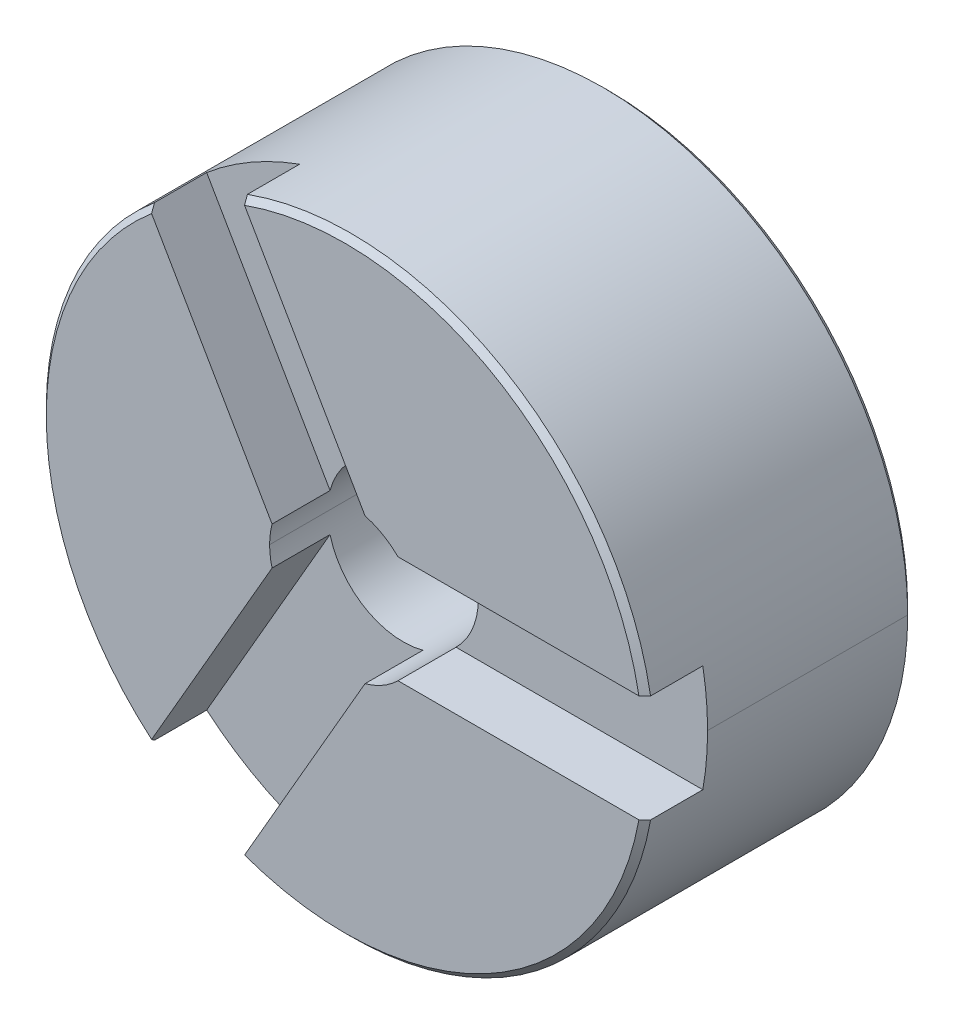
ISO-10303-21;
HEADER;
FILE_DESCRIPTION(('STEP AP214'),'2;1');
FILE_NAME('part.step','',(''),(''),'','','');
FILE_SCHEMA(('AUTOMOTIVE_DESIGN { 1 0 10303 214 1 1 1 1 }'));
ENDSEC;
DATA;
#1=APPLICATION_CONTEXT('core data for automotive mechanical design processes');
#2=APPLICATION_PROTOCOL_DEFINITION('international standard','automotive_design',2000,#1);
#3=PRODUCT_CONTEXT('',#1,'mechanical');
#4=PRODUCT('Part','Part','',(#3));
#5=PRODUCT_RELATED_PRODUCT_CATEGORY('part','',(#4));
#6=PRODUCT_DEFINITION_FORMATION('','',#4);
#7=PRODUCT_DEFINITION_CONTEXT('part definition',#1,'design');
#8=PRODUCT_DEFINITION('design','',#6,#7);
#9=PRODUCT_DEFINITION_SHAPE('','',#8);
#10=(LENGTH_UNIT() NAMED_UNIT(*) SI_UNIT(.MILLI.,.METRE.));
#11=(NAMED_UNIT(*) PLANE_ANGLE_UNIT() SI_UNIT($,.RADIAN.));
#12=(NAMED_UNIT(*) SI_UNIT($,.STERADIAN.) SOLID_ANGLE_UNIT());
#13=UNCERTAINTY_MEASURE_WITH_UNIT(LENGTH_MEASURE(1.E-05),#10,'distance_accuracy_value','');
#14=(GEOMETRIC_REPRESENTATION_CONTEXT(3) GLOBAL_UNCERTAINTY_ASSIGNED_CONTEXT((#13)) GLOBAL_UNIT_ASSIGNED_CONTEXT((#10,
#11,#12)) REPRESENTATION_CONTEXT('',''));
#15=CARTESIAN_POINT('',(0.,0.,0.));
#16=DIRECTION('',(0.,0.,1.));
#17=DIRECTION('',(1.,0.,0.));
#18=AXIS2_PLACEMENT_3D('',#15,#16,#17);
#19=CARTESIAN_POINT('',(0.,0.,0.));
#20=DIRECTION('',(0.,0.,-1.));
#21=DIRECTION('',(-1.,0.,0.));
#22=AXIS2_PLACEMENT_3D('',#19,#20,#21);
#23=CYLINDRICAL_SURFACE('',#22,105.);
#24=DIRECTION('',(0.,0.,1.));
#25=VECTOR('',#24,1.);
#26=CARTESIAN_POINT('',(105.,0.,-45.5));
#27=LINE('',#26,#25);
#28=CARTESIAN_POINT('',(105.,0.,-89.));
#29=VERTEX_POINT('',#28);
#30=CARTESIAN_POINT('',(105.,0.,-20.));
#31=VERTEX_POINT('',#30);
#32=EDGE_CURVE('E37',#29,#31,#27,.T.);
#33=ORIENTED_EDGE('',*,*,#32,.F.);
#34=CARTESIAN_POINT('',(0.,0.,-89.));
#35=DIRECTION('',(0.,0.,-1.));
#36=DIRECTION('',(-1.,0.,0.));
#37=AXIS2_PLACEMENT_3D('',#34,#35,#36);
#38=CIRCLE('',#37,105.);
#39=CARTESIAN_POINT('',(-105.,0.,-89.));
#40=VERTEX_POINT('',#39);
#41=EDGE_CURVE('E359',#40,#29,#38,.T.);
#42=ORIENTED_EDGE('',*,*,#41,.F.);
#43=DIRECTION('',(0.,0.,-1.));
#44=VECTOR('',#43,1.);
#45=CARTESIAN_POINT('',(-105.,0.,-45.5));
#46=LINE('',#45,#44);
#47=CARTESIAN_POINT('',(-105.,0.,-2.));
#48=VERTEX_POINT('',#47);
#49=EDGE_CURVE('E244',#48,#40,#46,.T.);
#50=ORIENTED_EDGE('',*,*,#49,.F.);
#51=CARTESIAN_POINT('',(0.,0.,-2.));
#52=DIRECTION('',(0.,0.,1.));
#53=DIRECTION('',(-1.,0.,0.));
#54=AXIS2_PLACEMENT_3D('',#51,#52,#53);
#55=CIRCLE('',#54,105.);
#56=CARTESIAN_POINT('',(-67.7001648064721,80.2601251255971,-2.));
#57=VERTEX_POINT('',#56);
#58=EDGE_CURVE('E436',#57,#48,#55,.T.);
#59=ORIENTED_EDGE('',*,*,#58,.F.);
#60=DIRECTION('',(0.,0.,1.));
#61=VECTOR('',#60,1.);
#62=CARTESIAN_POINT('',(-67.7001648064721,80.2601251255971,-11.));
#63=LINE('',#62,#61);
#64=CARTESIAN_POINT('',(-67.7001648064721,80.2601251255971,-20.));
#65=VERTEX_POINT('',#64);
#66=EDGE_CURVE('E278',#65,#57,#63,.T.);
#67=ORIENTED_EDGE('',*,*,#66,.F.);
#68=CARTESIAN_POINT('',(0.,0.,-20.));
#69=DIRECTION('',(0.,0.,1.));
#70=DIRECTION('',(1.,0.,0.));
#71=AXIS2_PLACEMENT_3D('',#68,#69,#70);
#72=CIRCLE('',#71,105.);
#73=CARTESIAN_POINT('',(-35.6572248664478,98.760125125597,-20.));
#74=VERTEX_POINT('',#73);
#75=EDGE_CURVE('E272',#74,#65,#72,.T.);
#76=ORIENTED_EDGE('',*,*,#75,.F.);
#77=DIRECTION('',(0.,0.,-1.));
#78=VECTOR('',#77,1.);
#79=CARTESIAN_POINT('',(-35.6572248664478,98.7601251255969,-11.));
#80=LINE('',#79,#78);
#81=CARTESIAN_POINT('',(-35.6572248664478,98.760125125597,-2.));
#82=VERTEX_POINT('',#81);
#83=EDGE_CURVE('E266',#82,#74,#80,.T.);
#84=ORIENTED_EDGE('',*,*,#83,.F.);
#85=CARTESIAN_POINT('',(0.,0.,-2.));
#86=DIRECTION('',(0.,0.,1.));
#87=DIRECTION('',(-1.,0.,0.));
#88=AXIS2_PLACEMENT_3D('',#85,#86,#87);
#89=CIRCLE('',#88,105.);
#90=CARTESIAN_POINT('',(103.357389672921,18.5,-2.));
#91=VERTEX_POINT('',#90);
#92=EDGE_CURVE('E298',#91,#82,#89,.T.);
#93=ORIENTED_EDGE('',*,*,#92,.F.);
#94=DIRECTION('',(0.,0.,-1.));
#95=VECTOR('',#94,1.);
#96=CARTESIAN_POINT('',(103.357389672921,18.5,-11.));
#97=LINE('',#96,#95);
#98=CARTESIAN_POINT('',(103.357389672921,18.5,-20.));
#99=VERTEX_POINT('',#98);
#100=EDGE_CURVE('E11',#91,#99,#97,.T.);
#101=ORIENTED_EDGE('',*,*,#100,.T.);
#102=CARTESIAN_POINT('',(0.,0.,-20.));
#103=DIRECTION('',(0.,0.,-1.));
#104=DIRECTION('',(1.,0.,0.));
#105=AXIS2_PLACEMENT_3D('',#102,#103,#104);
#106=CIRCLE('',#105,105.);
#107=EDGE_CURVE('E28',#99,#31,#106,.T.);
#108=ORIENTED_EDGE('',*,*,#107,.T.);
#109=EDGE_LOOP('',(#33,#42,#50,#59,#67,#76,#84,#93,#101,#108));
#110=FACE_BOUND('',#109,.T.);
#111=ADVANCED_FACE('F17',(#110),#23,.T.);
#112=CARTESIAN_POINT('',(0.,0.,0.));
#113=DIRECTION('',(0.,0.,-1.));
#114=DIRECTION('',(1.,0.,0.));
#115=AXIS2_PLACEMENT_3D('',#112,#113,#114);
#116=CONICAL_SURFACE('',#115,103.,0.785398163397448);
#117=DIRECTION('',(-0.707106781186547,0.,-0.707106781186548));
#118=VECTOR('',#117,1.);
#119=CARTESIAN_POINT('',(-103.,0.,0.));
#120=LINE('',#119,#118);
#121=CARTESIAN_POINT('',(-103.,0.,0.));
#122=VERTEX_POINT('',#121);
#123=EDGE_CURVE('E405',#122,#48,#120,.T.);
#124=ORIENTED_EDGE('',*,*,#123,.F.);
#125=CARTESIAN_POINT('',(0.,0.,0.));
#126=DIRECTION('',(0.,0.,-1.));
#127=DIRECTION('',(-1.,0.,0.));
#128=AXIS2_PLACEMENT_3D('',#125,#126,#127);
#129=CIRCLE('',#128,103.);
#130=CARTESIAN_POINT('',(-66.6839560914014,78.5,0.));
#131=VERTEX_POINT('',#130);
#132=EDGE_CURVE('E455',#122,#131,#129,.T.);
#133=ORIENTED_EDGE('',*,*,#132,.T.);
#134=CARTESIAN_POINT('',(3115.30832346852,-5432.87229535983,-6469.16924983146));
#135=DIRECTION('',(0.866025403743322,0.500000000071216,8.37208902852831E-11));
#136=DIRECTION('',(-0.350755756948617,0.607526791847581,0.712658120107242));
#137=AXIS2_PLACEMENT_3D('',#134,#135,#136);
#138=CIRCLE('',#137,9074.71488412742);
#139=EDGE_CURVE('E283',#57,#131,#138,.T.);
#140=ORIENTED_EDGE('',*,*,#139,.F.);
#141=ORIENTED_EDGE('',*,*,#58,.T.);
#142=EDGE_LOOP('',(#124,#133,#140,#141));
#143=FACE_BOUND('',#142,.T.);
#144=ADVANCED_FACE('F495',(#143),#116,.T.);
#145=CARTESIAN_POINT('',(0.,0.,0.));
#146=DIRECTION('',(0.,0.,1.));
#147=DIRECTION('',(-1.,0.,0.));
#148=AXIS2_PLACEMENT_3D('',#145,#146,#147);
#149=CYLINDRICAL_SURFACE('',#148,26.);
#150=DIRECTION('',(0.,0.,1.));
#151=VECTOR('',#150,1.);
#152=CARTESIAN_POINT('',(26.,0.,0.));
#153=LINE('',#152,#151);
#154=CARTESIAN_POINT('',(26.,0.,-86.));
#155=VERTEX_POINT('',#154);
#156=CARTESIAN_POINT('',(26.,0.,-20.));
#157=VERTEX_POINT('',#156);
#158=EDGE_CURVE('E349',#155,#157,#153,.T.);
#159=ORIENTED_EDGE('',*,*,#158,.F.);
#160=CARTESIAN_POINT('',(0.,0.,-86.));
#161=DIRECTION('',(0.,0.,-1.));
#162=DIRECTION('',(1.,0.,0.));
#163=AXIS2_PLACEMENT_3D('',#160,#161,#162);
#164=CIRCLE('',#163,26.);
#165=CARTESIAN_POINT('',(-26.,0.,-86.));
#166=VERTEX_POINT('',#165);
#167=EDGE_CURVE('E428',#155,#166,#164,.T.);
#168=ORIENTED_EDGE('',*,*,#167,.T.);
#169=DIRECTION('',(0.,0.,-1.));
#170=VECTOR('',#169,1.);
#171=CARTESIAN_POINT('',(-26.,0.,0.));
#172=LINE('',#171,#170);
#173=CARTESIAN_POINT('',(-26.,0.,0.));
#174=VERTEX_POINT('',#173);
#175=EDGE_CURVE('E400',#174,#166,#172,.T.);
#176=ORIENTED_EDGE('',*,*,#175,.F.);
#177=CARTESIAN_POINT('',(0.,0.,0.));
#178=DIRECTION('',(0.,0.,1.));
#179=DIRECTION('',(1.,0.,0.));
#180=AXIS2_PLACEMENT_3D('',#177,#178,#179);
#181=CIRCLE('',#180,26.);
#182=CARTESIAN_POINT('',(-25.1558829232347,-6.57126733229661,0.));
#183=VERTEX_POINT('',#182);
#184=EDGE_CURVE('E325',#174,#183,#181,.T.);
#185=ORIENTED_EDGE('',*,*,#184,.T.);
#186=DIRECTION('',(0.,0.,-1.));
#187=VECTOR('',#186,1.);
#188=CARTESIAN_POINT('',(-25.1558829232347,-6.57126733229661,-10.));
#189=LINE('',#188,#187);
#190=CARTESIAN_POINT('',(-25.1558829232347,-6.57126733229661,-20.));
#191=VERTEX_POINT('',#190);
#192=EDGE_CURVE('E234',#183,#191,#189,.T.);
#193=ORIENTED_EDGE('',*,*,#192,.T.);
#194=CARTESIAN_POINT('',(0.,0.,-20.));
#195=DIRECTION('',(0.,0.,1.));
#196=DIRECTION('',(-0.5,-0.866025403784436,0.));
#197=AXIS2_PLACEMENT_3D('',#194,#195,#196);
#198=CIRCLE('',#197,26.);
#199=CARTESIAN_POINT('',(6.88705701678943,-25.0712673322968,-20.));
#200=VERTEX_POINT('',#199);
#201=EDGE_CURVE('E229',#191,#200,#198,.T.);
#202=ORIENTED_EDGE('',*,*,#201,.T.);
#203=DIRECTION('',(0.,0.,1.));
#204=VECTOR('',#203,1.);
#205=CARTESIAN_POINT('',(6.88705701678943,-25.0712673322968,-10.));
#206=LINE('',#205,#204);
#207=CARTESIAN_POINT('',(6.88705701678943,-25.0712673322968,0.));
#208=VERTEX_POINT('',#207);
#209=EDGE_CURVE('E314',#200,#208,#206,.T.);
#210=ORIENTED_EDGE('',*,*,#209,.T.);
#211=CARTESIAN_POINT('',(0.,0.,0.));
#212=DIRECTION('',(0.,0.,1.));
#213=DIRECTION('',(-0.5,-0.866025403784436,0.));
#214=AXIS2_PLACEMENT_3D('',#211,#212,#213);
#215=CIRCLE('',#214,26.);
#216=CARTESIAN_POINT('',(18.2688259064451,-18.5,0.));
#217=VERTEX_POINT('',#216);
#218=EDGE_CURVE('E317',#208,#217,#215,.T.);
#219=ORIENTED_EDGE('',*,*,#218,.T.);
#220=DIRECTION('',(0.,0.,-1.));
#221=VECTOR('',#220,1.);
#222=CARTESIAN_POINT('',(18.2688259064451,-18.5,-10.));
#223=LINE('',#222,#221);
#224=CARTESIAN_POINT('',(18.2688259064451,-18.5,-20.));
#225=VERTEX_POINT('',#224);
#226=EDGE_CURVE('E188',#217,#225,#223,.T.);
#227=ORIENTED_EDGE('',*,*,#226,.T.);
#228=CARTESIAN_POINT('',(0.,0.,-20.));
#229=DIRECTION('',(0.,0.,1.));
#230=DIRECTION('',(1.,0.,0.));
#231=AXIS2_PLACEMENT_3D('',#228,#229,#230);
#232=CIRCLE('',#231,26.);
#233=EDGE_CURVE('E333',#225,#157,#232,.T.);
#234=ORIENTED_EDGE('',*,*,#233,.T.);
#235=EDGE_LOOP('',(#159,#168,#176,#185,#193,#202,#210,#219,#227,#234));
#236=FACE_BOUND('',#235,.T.);
#237=ADVANCED_FACE('F319',(#236),#149,.F.);
#238=CARTESIAN_POINT('',(0.,0.,-91.));
#239=DIRECTION('',(0.,0.,-1.));
#240=DIRECTION('',(1.,0.,0.));
#241=AXIS2_PLACEMENT_3D('',#238,#239,#240);
#242=CYLINDRICAL_SURFACE('',#241,85.);
#243=DIRECTION('',(0.,0.,-1.));
#244=VECTOR('',#243,1.);
#245=CARTESIAN_POINT('',(-85.,0.,-91.));
#246=LINE('',#245,#244);
#247=CARTESIAN_POINT('',(-85.,0.,-86.));
#248=VERTEX_POINT('',#247);
#249=CARTESIAN_POINT('',(-85.,0.,-91.));
#250=VERTEX_POINT('',#249);
#251=EDGE_CURVE('E338',#248,#250,#246,.T.);
#252=ORIENTED_EDGE('',*,*,#251,.F.);
#253=CARTESIAN_POINT('',(0.,0.,-86.));
#254=DIRECTION('',(0.,0.,-1.));
#255=DIRECTION('',(-1.,0.,0.));
#256=AXIS2_PLACEMENT_3D('',#253,#254,#255);
#257=CIRCLE('',#256,85.);
#258=CARTESIAN_POINT('',(85.,0.,-86.));
#259=VERTEX_POINT('',#258);
#260=EDGE_CURVE('E182',#259,#248,#257,.T.);
#261=ORIENTED_EDGE('',*,*,#260,.F.);
#262=DIRECTION('',(0.,0.,1.));
#263=VECTOR('',#262,1.);
#264=CARTESIAN_POINT('',(85.,0.,-91.));
#265=LINE('',#264,#263);
#266=CARTESIAN_POINT('',(85.,0.,-91.));
#267=VERTEX_POINT('',#266);
#268=EDGE_CURVE('E345',#267,#259,#265,.T.);
#269=ORIENTED_EDGE('',*,*,#268,.F.);
#270=CARTESIAN_POINT('',(0.,0.,-91.));
#271=DIRECTION('',(0.,0.,-1.));
#272=DIRECTION('',(-1.,0.,0.));
#273=AXIS2_PLACEMENT_3D('',#270,#271,#272);
#274=CIRCLE('',#273,85.);
#275=EDGE_CURVE('E337',#267,#250,#274,.T.);
#276=ORIENTED_EDGE('',*,*,#275,.T.);
#277=EDGE_LOOP('',(#252,#261,#269,#276));
#278=FACE_BOUND('',#277,.T.);
#279=ADVANCED_FACE('F484',(#278),#242,.F.);
#280=CARTESIAN_POINT('',(0.,0.,-91.));
#281=DIRECTION('',(0.,0.,1.));
#282=DIRECTION('',(1.,0.,0.));
#283=AXIS2_PLACEMENT_3D('',#280,#281,#282);
#284=CONICAL_SURFACE('',#283,103.,0.785398163397448);
#285=DIRECTION('',(-0.707106781186547,0.,0.707106781186548));
#286=VECTOR('',#285,1.);
#287=CARTESIAN_POINT('',(-103.,0.,-91.));
#288=LINE('',#287,#286);
#289=CARTESIAN_POINT('',(-103.,0.,-91.));
#290=VERTEX_POINT('',#289);
#291=EDGE_CURVE('E354',#290,#40,#288,.T.);
#292=ORIENTED_EDGE('',*,*,#291,.F.);
#293=CARTESIAN_POINT('',(0.,0.,-91.));
#294=DIRECTION('',(0.,0.,1.));
#295=DIRECTION('',(-1.,0.,0.));
#296=AXIS2_PLACEMENT_3D('',#293,#294,#295);
#297=CIRCLE('',#296,103.);
#298=CARTESIAN_POINT('',(103.,0.,-91.));
#299=VERTEX_POINT('',#298);
#300=EDGE_CURVE('E353',#290,#299,#297,.T.);
#301=ORIENTED_EDGE('',*,*,#300,.T.);
#302=DIRECTION('',(-0.707106781186547,0.,-0.707106781186548));
#303=VECTOR('',#302,1.);
#304=CARTESIAN_POINT('',(103.,0.,-91.));
#305=LINE('',#304,#303);
#306=EDGE_CURVE('E363',#29,#299,#305,.T.);
#307=ORIENTED_EDGE('',*,*,#306,.F.);
#308=CARTESIAN_POINT('',(0.,0.,-89.));
#309=DIRECTION('',(0.,0.,-1.));
#310=DIRECTION('',(-1.,0.,0.));
#311=AXIS2_PLACEMENT_3D('',#308,#309,#310);
#312=CIRCLE('',#311,105.);
#313=EDGE_CURVE('E358',#29,#40,#312,.T.);
#314=ORIENTED_EDGE('',*,*,#313,.T.);
#315=EDGE_LOOP('',(#292,#301,#307,#314));
#316=FACE_BOUND('',#315,.T.);
#317=ADVANCED_FACE('F472',(#316),#284,.T.);
#318=CARTESIAN_POINT('',(0.,0.,-91.));
#319=DIRECTION('',(0.,0.,1.));
#320=DIRECTION('',(1.,0.,0.));
#321=AXIS2_PLACEMENT_3D('',#318,#319,#320);
#322=CONICAL_SURFACE('',#321,103.,0.785398163397448);
#323=ORIENTED_EDGE('',*,*,#291,.T.);
#324=ORIENTED_EDGE('',*,*,#41,.T.);
#325=ORIENTED_EDGE('',*,*,#306,.T.);
#326=CARTESIAN_POINT('',(0.,0.,-91.));
#327=DIRECTION('',(0.,0.,1.));
#328=DIRECTION('',(-1.,0.,0.));
#329=AXIS2_PLACEMENT_3D('',#326,#327,#328);
#330=CIRCLE('',#329,103.);
#331=EDGE_CURVE('E341',#299,#290,#330,.T.);
#332=ORIENTED_EDGE('',*,*,#331,.T.);
#333=EDGE_LOOP('',(#323,#324,#325,#332));
#334=FACE_BOUND('',#333,.T.);
#335=ADVANCED_FACE('F468',(#334),#322,.T.);
#336=CARTESIAN_POINT('',(0.,0.,-91.));
#337=DIRECTION('',(0.,0.,-1.));
#338=DIRECTION('',(1.,0.,0.));
#339=AXIS2_PLACEMENT_3D('',#336,#337,#338);
#340=CYLINDRICAL_SURFACE('',#339,85.);
#341=ORIENTED_EDGE('',*,*,#251,.T.);
#342=CARTESIAN_POINT('',(0.,0.,-91.));
#343=DIRECTION('',(0.,0.,-1.));
#344=DIRECTION('',(-1.,0.,0.));
#345=AXIS2_PLACEMENT_3D('',#342,#343,#344);
#346=CIRCLE('',#345,85.);
#347=EDGE_CURVE('E342',#250,#267,#346,.T.);
#348=ORIENTED_EDGE('',*,*,#347,.T.);
#349=ORIENTED_EDGE('',*,*,#268,.T.);
#350=CARTESIAN_POINT('',(0.,0.,-86.));
#351=DIRECTION('',(0.,0.,-1.));
#352=DIRECTION('',(-1.,0.,0.));
#353=AXIS2_PLACEMENT_3D('',#350,#351,#352);
#354=CIRCLE('',#353,85.);
#355=EDGE_CURVE('E212',#248,#259,#354,.T.);
#356=ORIENTED_EDGE('',*,*,#355,.F.);
#357=EDGE_LOOP('',(#341,#348,#349,#356));
#358=FACE_BOUND('',#357,.T.);
#359=ADVANCED_FACE('F480',(#358),#340,.F.);
#360=CARTESIAN_POINT('',(0.,0.,0.));
#361=DIRECTION('',(0.,0.,1.));
#362=DIRECTION('',(-1.,0.,0.));
#363=AXIS2_PLACEMENT_3D('',#360,#361,#362);
#364=CYLINDRICAL_SURFACE('',#363,26.);
#365=ORIENTED_EDGE('',*,*,#158,.T.);
#366=CARTESIAN_POINT('',(0.,0.,-20.));
#367=DIRECTION('',(0.,0.,1.));
#368=DIRECTION('',(1.,0.,0.));
#369=AXIS2_PLACEMENT_3D('',#366,#367,#368);
#370=CIRCLE('',#369,26.);
#371=CARTESIAN_POINT('',(18.2688259064451,18.5,-20.));
#372=VERTEX_POINT('',#371);
#373=EDGE_CURVE('E378',#157,#372,#370,.T.);
#374=ORIENTED_EDGE('',*,*,#373,.T.);
#375=DIRECTION('',(0.,0.,1.));
#376=VECTOR('',#375,1.);
#377=CARTESIAN_POINT('',(18.2688259064451,18.5,-10.));
#378=LINE('',#377,#376);
#379=CARTESIAN_POINT('',(18.2688259064451,18.5,0.));
#380=VERTEX_POINT('',#379);
#381=EDGE_CURVE('E382',#372,#380,#378,.T.);
#382=ORIENTED_EDGE('',*,*,#381,.T.);
#383=CARTESIAN_POINT('',(0.,0.,0.));
#384=DIRECTION('',(0.,0.,1.));
#385=DIRECTION('',(1.,0.,0.));
#386=AXIS2_PLACEMENT_3D('',#383,#384,#385);
#387=CIRCLE('',#386,26.);
#388=CARTESIAN_POINT('',(6.88705701678968,25.0712673322967,0.));
#389=VERTEX_POINT('',#388);
#390=EDGE_CURVE('E386',#380,#389,#387,.T.);
#391=ORIENTED_EDGE('',*,*,#390,.T.);
#392=DIRECTION('',(0.,0.,1.));
#393=VECTOR('',#392,1.);
#394=CARTESIAN_POINT('',(6.88705701678967,25.0712673322967,-10.));
#395=LINE('',#394,#393);
#396=CARTESIAN_POINT('',(6.88705701678968,25.0712673322967,-20.));
#397=VERTEX_POINT('',#396);
#398=EDGE_CURVE('E261',#397,#389,#395,.T.);
#399=ORIENTED_EDGE('',*,*,#398,.F.);
#400=CARTESIAN_POINT('',(0.,0.,-20.));
#401=DIRECTION('',(0.,0.,-1.));
#402=DIRECTION('',(1.,0.,0.));
#403=AXIS2_PLACEMENT_3D('',#400,#401,#402);
#404=CIRCLE('',#403,26.);
#405=CARTESIAN_POINT('',(-25.1558829232346,6.57126733229686,-20.));
#406=VERTEX_POINT('',#405);
#407=EDGE_CURVE('E271',#406,#397,#404,.T.);
#408=ORIENTED_EDGE('',*,*,#407,.F.);
#409=DIRECTION('',(0.,0.,-1.));
#410=VECTOR('',#409,1.);
#411=CARTESIAN_POINT('',(-25.1558829232346,6.57126733229686,-10.));
#412=LINE('',#411,#410);
#413=CARTESIAN_POINT('',(-25.1558829232346,6.57126733229686,0.));
#414=VERTEX_POINT('',#413);
#415=EDGE_CURVE('E277',#414,#406,#412,.T.);
#416=ORIENTED_EDGE('',*,*,#415,.F.);
#417=CARTESIAN_POINT('',(0.,0.,0.));
#418=DIRECTION('',(0.,0.,1.));
#419=DIRECTION('',(1.,0.,0.));
#420=AXIS2_PLACEMENT_3D('',#417,#418,#419);
#421=CIRCLE('',#420,26.);
#422=EDGE_CURVE('E390',#414,#174,#421,.T.);
#423=ORIENTED_EDGE('',*,*,#422,.T.);
#424=ORIENTED_EDGE('',*,*,#175,.T.);
#425=CARTESIAN_POINT('',(0.,0.,-86.));
#426=DIRECTION('',(0.,0.,-1.));
#427=DIRECTION('',(1.,0.,0.));
#428=AXIS2_PLACEMENT_3D('',#425,#426,#427);
#429=CIRCLE('',#428,26.);
#430=EDGE_CURVE('E401',#166,#155,#429,.T.);
#431=ORIENTED_EDGE('',*,*,#430,.T.);
#432=EDGE_LOOP('',(#365,#374,#382,#391,#399,#408,#416,#423,#424,#431));
#433=FACE_BOUND('',#432,.T.);
#434=ADVANCED_FACE('F438',(#433),#364,.F.);
#435=CARTESIAN_POINT('',(0.,0.,0.));
#436=DIRECTION('',(0.,0.,-1.));
#437=DIRECTION('',(1.,0.,0.));
#438=AXIS2_PLACEMENT_3D('',#435,#436,#437);
#439=CONICAL_SURFACE('',#438,103.,0.785398163397448);
#440=ORIENTED_EDGE('',*,*,#123,.T.);
#441=CARTESIAN_POINT('',(0.,0.,-2.));
#442=DIRECTION('',(0.,0.,1.));
#443=DIRECTION('',(-1.,0.,0.));
#444=AXIS2_PLACEMENT_3D('',#441,#442,#443);
#445=CIRCLE('',#444,105.);
#446=CARTESIAN_POINT('',(-67.7001648064729,-80.2601251255965,-2.));
#447=VERTEX_POINT('',#446);
#448=EDGE_CURVE('E406',#48,#447,#445,.T.);
#449=ORIENTED_EDGE('',*,*,#448,.T.);
#450=CARTESIAN_POINT('',(3115.30832311077,5432.87229605646,-6469.16925026273));
#451=DIRECTION('',(-0.86602540376874,0.500000000027191,-3.19963366902484E-11));
#452=DIRECTION('',(-0.350755756885806,-0.607526791883838,0.712658120107248));
#453=AXIS2_PLACEMENT_3D('',#450,#451,#452);
#454=CIRCLE('',#453,9074.71488473251);
#455=CARTESIAN_POINT('',(-66.6839560914021,-78.5,0.));
#456=VERTEX_POINT('',#455);
#457=EDGE_CURVE('E239',#447,#456,#454,.T.);
#458=ORIENTED_EDGE('',*,*,#457,.T.);
#459=CARTESIAN_POINT('',(0.,0.,0.));
#460=DIRECTION('',(0.,0.,-1.));
#461=DIRECTION('',(-1.,0.,0.));
#462=AXIS2_PLACEMENT_3D('',#459,#460,#461);
#463=CIRCLE('',#462,103.);
#464=EDGE_CURVE('E411',#456,#122,#463,.T.);
#465=ORIENTED_EDGE('',*,*,#464,.T.);
#466=EDGE_LOOP('',(#440,#449,#458,#465));
#467=FACE_BOUND('',#466,.T.);
#468=ADVANCED_FACE('F458',(#467),#439,.T.);
#469=CARTESIAN_POINT('',(0.,0.,0.));
#470=DIRECTION('',(0.,0.,-1.));
#471=DIRECTION('',(-1.,0.,0.));
#472=AXIS2_PLACEMENT_3D('',#469,#470,#471);
#473=CYLINDRICAL_SURFACE('',#472,105.);
#474=ORIENTED_EDGE('',*,*,#32,.T.);
#475=CARTESIAN_POINT('',(0.,0.,-20.));
#476=DIRECTION('',(0.,0.,-1.));
#477=DIRECTION('',(1.,0.,0.));
#478=AXIS2_PLACEMENT_3D('',#475,#476,#477);
#479=CIRCLE('',#478,105.);
#480=CARTESIAN_POINT('',(103.357389672921,-18.5,-20.));
#481=VERTEX_POINT('',#480);
#482=EDGE_CURVE('E415',#31,#481,#479,.T.);
#483=ORIENTED_EDGE('',*,*,#482,.T.);
#484=DIRECTION('',(0.,0.,1.));
#485=VECTOR('',#484,1.);
#486=CARTESIAN_POINT('',(103.357389672921,-18.5,-11.));
#487=LINE('',#486,#485);
#488=CARTESIAN_POINT('',(103.357389672921,-18.5,-2.));
#489=VERTEX_POINT('',#488);
#490=EDGE_CURVE('E254',#481,#489,#487,.T.);
#491=ORIENTED_EDGE('',*,*,#490,.T.);
#492=CARTESIAN_POINT('',(0.,0.,-2.));
#493=DIRECTION('',(0.,0.,1.));
#494=DIRECTION('',(0.5,0.866025403784436,0.));
#495=AXIS2_PLACEMENT_3D('',#492,#493,#494);
#496=CIRCLE('',#495,105.);
#497=CARTESIAN_POINT('',(-35.6572248664488,-98.7601251255966,-2.));
#498=VERTEX_POINT('',#497);
#499=EDGE_CURVE('E178',#498,#489,#496,.T.);
#500=ORIENTED_EDGE('',*,*,#499,.F.);
#501=DIRECTION('',(0.,0.,-1.));
#502=VECTOR('',#501,1.);
#503=CARTESIAN_POINT('',(-35.6572248664488,-98.7601251255966,-11.));
#504=LINE('',#503,#502);
#505=CARTESIAN_POINT('',(-35.6572248664488,-98.7601251255966,-20.));
#506=VERTEX_POINT('',#505);
#507=EDGE_CURVE('E247',#498,#506,#504,.T.);
#508=ORIENTED_EDGE('',*,*,#507,.T.);
#509=CARTESIAN_POINT('',(0.,0.,-20.));
#510=DIRECTION('',(0.,0.,-1.));
#511=DIRECTION('',(-0.5,-0.866025403784436,0.));
#512=AXIS2_PLACEMENT_3D('',#509,#510,#511);
#513=CIRCLE('',#512,105.);
#514=CARTESIAN_POINT('',(-67.7001648064729,-80.2601251255965,-20.));
#515=VERTEX_POINT('',#514);
#516=EDGE_CURVE('E226',#506,#515,#513,.T.);
#517=ORIENTED_EDGE('',*,*,#516,.T.);
#518=DIRECTION('',(0.,0.,1.));
#519=VECTOR('',#518,1.);
#520=CARTESIAN_POINT('',(-67.7001648064729,-80.2601251255965,-11.));
#521=LINE('',#520,#519);
#522=EDGE_CURVE('E237',#515,#447,#521,.T.);
#523=ORIENTED_EDGE('',*,*,#522,.T.);
#524=ORIENTED_EDGE('',*,*,#448,.F.);
#525=ORIENTED_EDGE('',*,*,#49,.T.);
#526=ORIENTED_EDGE('',*,*,#313,.F.);
#527=EDGE_LOOP('',(#474,#483,#491,#500,#508,#517,#523,#524,#525,#526));
#528=FACE_BOUND('',#527,.T.);
#529=ADVANCED_FACE('F246',(#528),#473,.T.);
#530=CARTESIAN_POINT('',(16.0214699700122,9.25,-9.));
#531=DIRECTION('',(0.866025403784441,0.5,0.));
#532=DIRECTION('',(0.,0.,1.));
#533=AXIS2_PLACEMENT_3D('',#530,#531,#532);
#534=PLANE('',#533);
#535=ORIENTED_EDGE('',*,*,#398,.T.);
#536=DIRECTION('',(-0.5,0.866025403784441,0.));
#537=VECTOR('',#536,1.);
#538=CARTESIAN_POINT('',(16.0214699700121,9.25,0.));
#539=LINE('',#538,#537);
#540=CARTESIAN_POINT('',(-34.6410161513771,97.,0.));
#541=VERTEX_POINT('',#540);
#542=EDGE_CURVE('E257',#389,#541,#539,.T.);
#543=ORIENTED_EDGE('',*,*,#542,.T.);
#544=CARTESIAN_POINT('',(3147.58871754416,-5414.78358083445,-6469.65185826135));
#545=DIRECTION('',(-0.866025403798294,-0.499999999976001,2.81832198505629E-11));
#546=DIRECTION('',(-0.35064377855075,0.607332839886878,0.712878504486278));
#547=AXIS2_PLACEMENT_3D('',#544,#545,#546);
#548=CIRCLE('',#547,9075.39197429382);
#549=EDGE_CURVE('E262',#541,#82,#548,.T.);
#550=ORIENTED_EDGE('',*,*,#549,.T.);
#551=ORIENTED_EDGE('',*,*,#83,.T.);
#552=DIRECTION('',(-0.5,0.866025403784441,0.));
#553=VECTOR('',#552,1.);
#554=CARTESIAN_POINT('',(16.0214699700122,9.25,-20.));
#555=LINE('',#554,#553);
#556=EDGE_CURVE('E267',#397,#74,#555,.T.);
#557=ORIENTED_EDGE('',*,*,#556,.F.);
#558=EDGE_LOOP('',(#535,#543,#550,#551,#557));
#559=FACE_BOUND('',#558,.T.);
#560=ADVANCED_FACE('F520',(#559),#534,.F.);
#561=CARTESIAN_POINT('',(0.,0.,-20.));
#562=DIRECTION('',(0.,0.,-1.));
#563=DIRECTION('',(0.,1.,0.));
#564=AXIS2_PLACEMENT_3D('',#561,#562,#563);
#565=PLANE('',#564);
#566=ORIENTED_EDGE('',*,*,#407,.T.);
#567=ORIENTED_EDGE('',*,*,#556,.T.);
#568=ORIENTED_EDGE('',*,*,#75,.T.);
#569=DIRECTION('',(-0.5,0.866025403784441,0.));
#570=VECTOR('',#569,1.);
#571=CARTESIAN_POINT('',(-16.0214699700122,-9.25,-20.));
#572=LINE('',#571,#570);
#573=EDGE_CURVE('E273',#406,#65,#572,.T.);
#574=ORIENTED_EDGE('',*,*,#573,.F.);
#575=EDGE_LOOP('',(#566,#567,#568,#574));
#576=FACE_BOUND('',#575,.T.);
#577=ADVANCED_FACE('F523',(#576),#565,.F.);
#578=CARTESIAN_POINT('',(-16.0214699700122,-9.25,-9.));
#579=DIRECTION('',(-0.866025403784441,-0.5,0.));
#580=DIRECTION('',(0.5,-0.866025403784441,0.));
#581=AXIS2_PLACEMENT_3D('',#578,#579,#580);
#582=PLANE('',#581);
#583=ORIENTED_EDGE('',*,*,#415,.T.);
#584=ORIENTED_EDGE('',*,*,#573,.T.);
#585=ORIENTED_EDGE('',*,*,#66,.T.);
#586=ORIENTED_EDGE('',*,*,#139,.T.);
#587=DIRECTION('',(0.5,-0.866025403784441,0.));
#588=VECTOR('',#587,1.);
#589=CARTESIAN_POINT('',(-16.0214699700121,-9.25,0.));
#590=LINE('',#589,#588);
#591=EDGE_CURVE('E279',#131,#414,#590,.T.);
#592=ORIENTED_EDGE('',*,*,#591,.T.);
#593=EDGE_LOOP('',(#583,#584,#585,#586,#592));
#594=FACE_BOUND('',#593,.T.);
#595=ADVANCED_FACE('F527',(#594),#582,.F.);
#596=CARTESIAN_POINT('',(0.,0.,0.));
#597=DIRECTION('',(0.,0.,1.));
#598=DIRECTION('',(-1.,0.,0.));
#599=AXIS2_PLACEMENT_3D('',#596,#597,#598);
#600=PLANE('',#599);
#601=ORIENTED_EDGE('',*,*,#542,.F.);
#602=ORIENTED_EDGE('',*,*,#390,.F.);
#603=DIRECTION('',(1.,0.,0.));
#604=VECTOR('',#603,1.);
#605=CARTESIAN_POINT('',(0.,18.5,0.));
#606=LINE('',#605,#604);
#607=CARTESIAN_POINT('',(101.324972242779,18.5,0.));
#608=VERTEX_POINT('',#607);
#609=EDGE_CURVE('E284',#380,#608,#606,.T.);
#610=ORIENTED_EDGE('',*,*,#609,.T.);
#611=CARTESIAN_POINT('',(0.,0.,0.));
#612=DIRECTION('',(0.,0.,-1.));
#613=DIRECTION('',(-1.,0.,0.));
#614=AXIS2_PLACEMENT_3D('',#611,#612,#613);
#615=CIRCLE('',#614,103.);
#616=EDGE_CURVE('E289',#541,#608,#615,.T.);
#617=ORIENTED_EDGE('',*,*,#616,.F.);
#618=EDGE_LOOP('',(#601,#602,#610,#617));
#619=FACE_BOUND('',#618,.T.);
#620=ADVANCED_FACE('F531',(#619),#600,.T.);
#621=CARTESIAN_POINT('',(0.,0.,0.));
#622=DIRECTION('',(0.,0.,1.));
#623=DIRECTION('',(-1.,0.,0.));
#624=AXIS2_PLACEMENT_3D('',#621,#622,#623);
#625=PLANE('',#624);
#626=ORIENTED_EDGE('',*,*,#591,.F.);
#627=ORIENTED_EDGE('',*,*,#132,.F.);
#628=ORIENTED_EDGE('',*,*,#464,.F.);
#629=DIRECTION('',(0.5,0.866025403784436,0.));
#630=VECTOR('',#629,1.);
#631=CARTESIAN_POINT('',(-16.0214699700121,9.25,0.));
#632=LINE('',#631,#630);
#633=EDGE_CURVE('E288',#456,#183,#632,.T.);
#634=ORIENTED_EDGE('',*,*,#633,.T.);
#635=ORIENTED_EDGE('',*,*,#184,.F.);
#636=ORIENTED_EDGE('',*,*,#422,.F.);
#637=EDGE_LOOP('',(#626,#627,#628,#634,#635,#636));
#638=FACE_BOUND('',#637,.T.);
#639=ADVANCED_FACE('F452',(#638),#625,.T.);
#640=CARTESIAN_POINT('',(0.,0.,0.));
#641=DIRECTION('',(0.,0.,-1.));
#642=DIRECTION('',(1.,0.,0.));
#643=AXIS2_PLACEMENT_3D('',#640,#641,#642);
#644=CONICAL_SURFACE('',#643,103.,0.785398163397448);
#645=ORIENTED_EDGE('',*,*,#549,.F.);
#646=ORIENTED_EDGE('',*,*,#616,.T.);
#647=CARTESIAN_POINT('',(-6263.13449736861,18.5,-6469.6518598863));
#648=DIRECTION('',(0.,1.,0.));
#649=DIRECTION('',(0.701287557169986,0.,0.712878504486251));
#650=AXIS2_PLACEMENT_3D('',#647,#648,#649);
#651=CIRCLE('',#650,9075.3919765736);
#652=EDGE_CURVE('E292',#608,#91,#651,.T.);
#653=ORIENTED_EDGE('',*,*,#652,.T.);
#654=ORIENTED_EDGE('',*,*,#92,.T.);
#655=EDGE_LOOP('',(#645,#646,#653,#654));
#656=FACE_BOUND('',#655,.T.);
#657=ADVANCED_FACE('F538',(#656),#644,.T.);
#658=CARTESIAN_POINT('',(0.,18.5,-9.));
#659=DIRECTION('',(0.,1.,0.));
#660=DIRECTION('',(-1.,0.,0.));
#661=AXIS2_PLACEMENT_3D('',#658,#659,#660);
#662=PLANE('',#661);
#663=ORIENTED_EDGE('',*,*,#381,.F.);
#664=DIRECTION('',(1.,0.,0.));
#665=VECTOR('',#664,1.);
#666=CARTESIAN_POINT('',(0.,18.5,-20.));
#667=LINE('',#666,#665);
#668=EDGE_CURVE('E299',#372,#99,#667,.T.);
#669=ORIENTED_EDGE('',*,*,#668,.T.);
#670=ORIENTED_EDGE('',*,*,#100,.F.);
#671=ORIENTED_EDGE('',*,*,#652,.F.);
#672=ORIENTED_EDGE('',*,*,#609,.F.);
#673=EDGE_LOOP('',(#663,#669,#670,#671,#672));
#674=FACE_BOUND('',#673,.T.);
#675=ADVANCED_FACE('F541',(#674),#662,.F.);
#676=CARTESIAN_POINT('',(16.0214699700121,-9.25,-9.));
#677=DIRECTION('',(0.866025403784436,-0.5,0.));
#678=DIRECTION('',(0.,0.,1.));
#679=AXIS2_PLACEMENT_3D('',#676,#677,#678);
#680=PLANE('',#679);
#681=ORIENTED_EDGE('',*,*,#209,.F.);
#682=DIRECTION('',(-0.5,-0.866025403784436,0.));
#683=VECTOR('',#682,1.);
#684=CARTESIAN_POINT('',(16.0214699700121,-9.25,-20.));
#685=LINE('',#684,#683);
#686=EDGE_CURVE('E208',#200,#506,#685,.T.);
#687=ORIENTED_EDGE('',*,*,#686,.T.);
#688=ORIENTED_EDGE('',*,*,#507,.F.);
#689=CARTESIAN_POINT('',(3147.58871896113,5414.78358152762,-6469.65185959131));
#690=DIRECTION('',(0.866025403764339,-0.500000000034814,4.11144345653654E-11));
#691=DIRECTION('',(-0.35064377863479,-0.607332839838388,0.712878504486252));
#692=AXIS2_PLACEMENT_3D('',#689,#690,#691);
#693=CIRCLE('',#692,9075.39197615976);
#694=CARTESIAN_POINT('',(-34.641016151378,-97.,0.));
#695=VERTEX_POINT('',#694);
#696=EDGE_CURVE('E169',#695,#498,#693,.T.);
#697=ORIENTED_EDGE('',*,*,#696,.F.);
#698=DIRECTION('',(-0.5,-0.866025403784436,0.));
#699=VECTOR('',#698,1.);
#700=CARTESIAN_POINT('',(16.0214699700121,-9.25,0.));
#701=LINE('',#700,#699);
#702=EDGE_CURVE('E193',#208,#695,#701,.T.);
#703=ORIENTED_EDGE('',*,*,#702,.F.);
#704=EDGE_LOOP('',(#681,#687,#688,#697,#703));
#705=FACE_BOUND('',#704,.T.);
#706=ADVANCED_FACE('F312',(#705),#680,.F.);
#707=CARTESIAN_POINT('',(0.,0.,-20.));
#708=DIRECTION('',(0.,0.,-1.));
#709=DIRECTION('',(0.,1.,0.));
#710=AXIS2_PLACEMENT_3D('',#707,#708,#709);
#711=PLANE('',#710);
#712=ORIENTED_EDGE('',*,*,#233,.F.);
#713=DIRECTION('',(1.,0.,0.));
#714=VECTOR('',#713,1.);
#715=CARTESIAN_POINT('',(0.,-18.5,-20.));
#716=LINE('',#715,#714);
#717=EDGE_CURVE('E213',#225,#481,#716,.T.);
#718=ORIENTED_EDGE('',*,*,#717,.T.);
#719=ORIENTED_EDGE('',*,*,#482,.F.);
#720=ORIENTED_EDGE('',*,*,#107,.F.);
#721=ORIENTED_EDGE('',*,*,#668,.F.);
#722=ORIENTED_EDGE('',*,*,#373,.F.);
#723=EDGE_LOOP('',(#712,#718,#719,#720,#721,#722));
#724=FACE_BOUND('',#723,.T.);
#725=ADVANCED_FACE('F424',(#724),#711,.F.);
#726=CARTESIAN_POINT('',(0.,0.,-20.));
#727=DIRECTION('',(0.,0.,-1.));
#728=DIRECTION('',(0.,1.,0.));
#729=AXIS2_PLACEMENT_3D('',#726,#727,#728);
#730=PLANE('',#729);
#731=ORIENTED_EDGE('',*,*,#201,.F.);
#732=DIRECTION('',(-0.5,-0.866025403784436,0.));
#733=VECTOR('',#732,1.);
#734=CARTESIAN_POINT('',(-16.0214699700121,9.25,-20.));
#735=LINE('',#734,#733);
#736=EDGE_CURVE('E192',#191,#515,#735,.T.);
#737=ORIENTED_EDGE('',*,*,#736,.T.);
#738=ORIENTED_EDGE('',*,*,#516,.F.);
#739=ORIENTED_EDGE('',*,*,#686,.F.);
#740=EDGE_LOOP('',(#731,#737,#738,#739));
#741=FACE_BOUND('',#740,.T.);
#742=ADVANCED_FACE('F223',(#741),#730,.F.);
#743=CARTESIAN_POINT('',(0.,-18.5,-9.));
#744=DIRECTION('',(0.,-1.,0.));
#745=DIRECTION('',(0.,0.,1.));
#746=AXIS2_PLACEMENT_3D('',#743,#744,#745);
#747=PLANE('',#746);
#748=ORIENTED_EDGE('',*,*,#226,.F.);
#749=DIRECTION('',(-1.,0.,0.));
#750=VECTOR('',#749,1.);
#751=CARTESIAN_POINT('',(0.,-18.5,0.));
#752=LINE('',#751,#750);
#753=CARTESIAN_POINT('',(101.324972242779,-18.5,0.));
#754=VERTEX_POINT('',#753);
#755=EDGE_CURVE('E184',#754,#217,#752,.T.);
#756=ORIENTED_EDGE('',*,*,#755,.F.);
#757=CARTESIAN_POINT('',(-6262.65958467083,-18.5,-6469.16924946383));
#758=DIRECTION('',(0.,-1.,0.));
#759=DIRECTION('',(0.701511513693984,0.,0.712658120107233));
#760=AXIS2_PLACEMENT_3D('',#757,#758,#759);
#761=CIRCLE('',#760,9074.71488361168);
#762=EDGE_CURVE('E175',#489,#754,#761,.T.);
#763=ORIENTED_EDGE('',*,*,#762,.F.);
#764=ORIENTED_EDGE('',*,*,#490,.F.);
#765=ORIENTED_EDGE('',*,*,#717,.F.);
#766=EDGE_LOOP('',(#748,#756,#763,#764,#765));
#767=FACE_BOUND('',#766,.T.);
#768=ADVANCED_FACE('F185',(#767),#747,.F.);
#769=CARTESIAN_POINT('',(-16.0214699700121,9.25,-9.));
#770=DIRECTION('',(-0.866025403784436,0.5,0.));
#771=DIRECTION('',(0.,0.,-1.));
#772=AXIS2_PLACEMENT_3D('',#769,#770,#771);
#773=PLANE('',#772);
#774=ORIENTED_EDGE('',*,*,#192,.F.);
#775=ORIENTED_EDGE('',*,*,#633,.F.);
#776=ORIENTED_EDGE('',*,*,#457,.F.);
#777=ORIENTED_EDGE('',*,*,#522,.F.);
#778=ORIENTED_EDGE('',*,*,#736,.F.);
#779=EDGE_LOOP('',(#774,#775,#776,#777,#778));
#780=FACE_BOUND('',#779,.T.);
#781=ADVANCED_FACE('F232',(#780),#773,.F.);
#782=CARTESIAN_POINT('',(0.,0.,0.));
#783=DIRECTION('',(0.,0.,1.));
#784=DIRECTION('',(-1.,0.,0.));
#785=AXIS2_PLACEMENT_3D('',#782,#783,#784);
#786=PLANE('',#785);
#787=ORIENTED_EDGE('',*,*,#755,.T.);
#788=ORIENTED_EDGE('',*,*,#218,.F.);
#789=ORIENTED_EDGE('',*,*,#702,.T.);
#790=CARTESIAN_POINT('',(0.,0.,0.));
#791=DIRECTION('',(0.,0.,-1.));
#792=DIRECTION('',(0.5,0.866025403784436,0.));
#793=AXIS2_PLACEMENT_3D('',#790,#791,#792);
#794=CIRCLE('',#793,103.);
#795=EDGE_CURVE('E21',#754,#695,#794,.T.);
#796=ORIENTED_EDGE('',*,*,#795,.F.);
#797=EDGE_LOOP('',(#787,#788,#789,#796));
#798=FACE_BOUND('',#797,.T.);
#799=ADVANCED_FACE('F195',(#798),#786,.T.);
#800=CARTESIAN_POINT('',(0.,0.,-86.));
#801=DIRECTION('',(0.,0.,1.));
#802=DIRECTION('',(-1.,0.,0.));
#803=AXIS2_PLACEMENT_3D('',#800,#801,#802);
#804=PLANE('',#803);
#805=ORIENTED_EDGE('',*,*,#355,.T.);
#806=ORIENTED_EDGE('',*,*,#260,.T.);
#807=EDGE_LOOP('',(#805,#806));
#808=FACE_BOUND('',#807,.T.);
#809=ORIENTED_EDGE('',*,*,#167,.F.);
#810=ORIENTED_EDGE('',*,*,#430,.F.);
#811=EDGE_LOOP('',(#809,#810));
#812=FACE_BOUND('',#811,.T.);
#813=ADVANCED_FACE('F434',(#808,#812),#804,.F.);
#814=CARTESIAN_POINT('',(0.,0.,-91.));
#815=DIRECTION('',(0.,0.,1.));
#816=DIRECTION('',(-1.,0.,0.));
#817=AXIS2_PLACEMENT_3D('',#814,#815,#816);
#818=PLANE('',#817);
#819=ORIENTED_EDGE('',*,*,#331,.F.);
#820=ORIENTED_EDGE('',*,*,#300,.F.);
#821=EDGE_LOOP('',(#819,#820));
#822=FACE_BOUND('',#821,.T.);
#823=ORIENTED_EDGE('',*,*,#347,.F.);
#824=ORIENTED_EDGE('',*,*,#275,.F.);
#825=EDGE_LOOP('',(#823,#824));
#826=FACE_BOUND('',#825,.T.);
#827=ADVANCED_FACE('F474',(#822,#826),#818,.F.);
#828=CARTESIAN_POINT('',(0.,0.,0.));
#829=DIRECTION('',(0.,0.,-1.));
#830=DIRECTION('',(-0.5,-0.866025403784436,0.));
#831=AXIS2_PLACEMENT_3D('',#828,#829,#830);
#832=CONICAL_SURFACE('',#831,103.,0.785398163397448);
#833=ORIENTED_EDGE('',*,*,#762,.T.);
#834=ORIENTED_EDGE('',*,*,#795,.T.);
#835=ORIENTED_EDGE('',*,*,#696,.T.);
#836=ORIENTED_EDGE('',*,*,#499,.T.);
#837=EDGE_LOOP('',(#833,#834,#835,#836));
#838=FACE_BOUND('',#837,.T.);
#839=ADVANCED_FACE('F19',(#838),#832,.T.);
#840=CLOSED_SHELL('',(#111,#144,#237,#279,#317,#335,#359,#434,#468,#529,#560,#577,#595,#620,
#639,#657,#675,#706,#725,#742,#768,#781,#799,#813,#827,#839));
#841=MANIFOLD_SOLID_BREP('B1',#840);
#842=ADVANCED_BREP_SHAPE_REPRESENTATION('',(#18,#841),#14);
#843=SHAPE_DEFINITION_REPRESENTATION(#9,#842);
ENDSEC;
END-ISO-10303-21;
